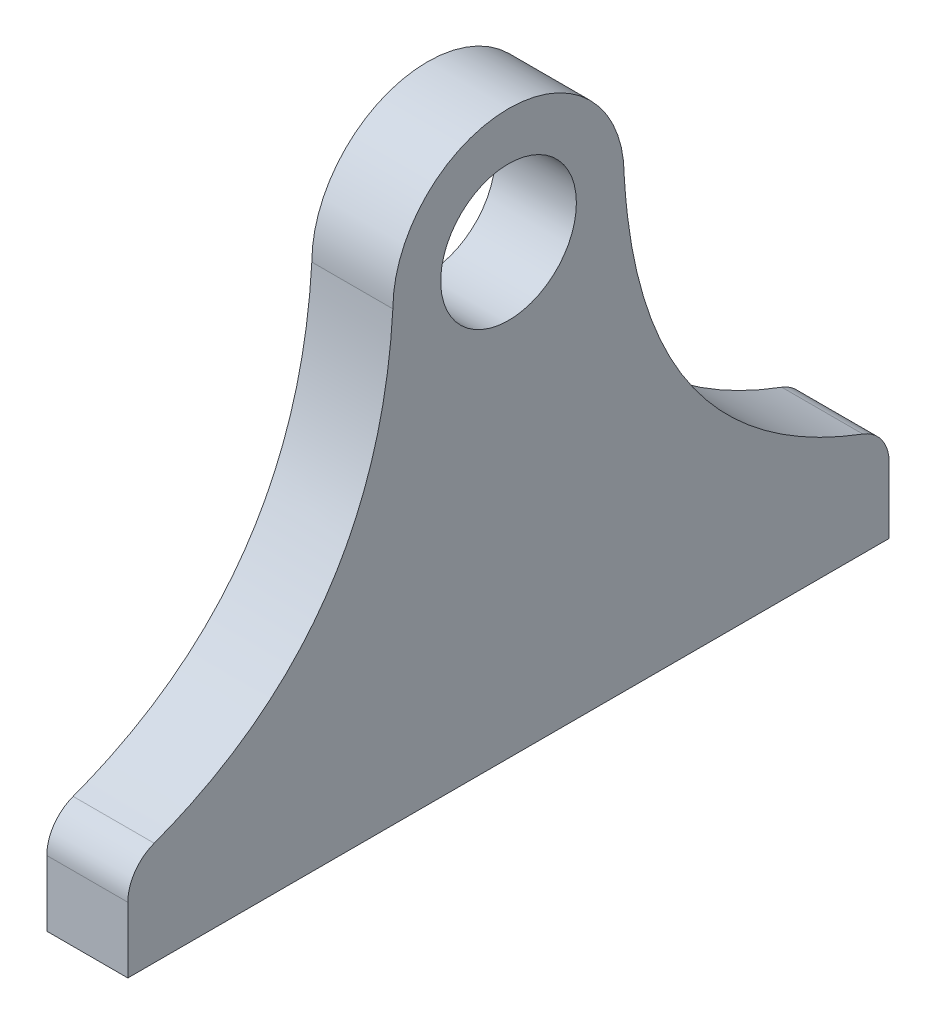
ISO-10303-21;
HEADER;
FILE_DESCRIPTION(('STEP AP214'),'2;1');
FILE_NAME('part.step','',(''),(''),'','','');
FILE_SCHEMA(('AUTOMOTIVE_DESIGN { 1 0 10303 214 1 1 1 1 }'));
ENDSEC;
DATA;
#1=APPLICATION_CONTEXT('core data for automotive mechanical design processes');
#2=APPLICATION_PROTOCOL_DEFINITION('international standard','automotive_design',2000,#1);
#3=PRODUCT_CONTEXT('',#1,'mechanical');
#4=PRODUCT('Part','Part','',(#3));
#5=PRODUCT_RELATED_PRODUCT_CATEGORY('part','',(#4));
#6=PRODUCT_DEFINITION_FORMATION('','',#4);
#7=PRODUCT_DEFINITION_CONTEXT('part definition',#1,'design');
#8=PRODUCT_DEFINITION('design','',#6,#7);
#9=PRODUCT_DEFINITION_SHAPE('','',#8);
#10=(LENGTH_UNIT() NAMED_UNIT(*) SI_UNIT(.MILLI.,.METRE.));
#11=(NAMED_UNIT(*) PLANE_ANGLE_UNIT() SI_UNIT($,.RADIAN.));
#12=(NAMED_UNIT(*) SI_UNIT($,.STERADIAN.) SOLID_ANGLE_UNIT());
#13=UNCERTAINTY_MEASURE_WITH_UNIT(LENGTH_MEASURE(1.E-05),#10,'distance_accuracy_value','');
#14=(GEOMETRIC_REPRESENTATION_CONTEXT(3) GLOBAL_UNCERTAINTY_ASSIGNED_CONTEXT((#13)) GLOBAL_UNIT_ASSIGNED_CONTEXT((#10,
#11,#12)) REPRESENTATION_CONTEXT('',''));
#15=CARTESIAN_POINT('',(0.,0.,0.));
#16=DIRECTION('',(0.,0.,1.));
#17=DIRECTION('',(1.,0.,0.));
#18=AXIS2_PLACEMENT_3D('',#15,#16,#17);
#19=CARTESIAN_POINT('',(10.,15.6514826724427,23.4182866538508));
#20=DIRECTION('',(-1.,0.,0.));
#21=DIRECTION('',(0.,0.,1.));
#22=AXIS2_PLACEMENT_3D('',#19,#20,#21);
#23=PLANE('',#22);
#24=CARTESIAN_POINT('',(10.,43.4710042432815,14.2674065208719));
#25=CARTESIAN_POINT('',(10.,9.56746322324458,16.2210968149973));
#26=CARTESIAN_POINT('',(10.,0.,46.9635464645365));
#27=B_SPLINE_CURVE_WITH_KNOTS('',2,(#24,#25,#26),.UNSPECIFIED.,.F.,.F.,(3,3),(0.,1.),.UNSPECIFIED.);
#28=CARTESIAN_POINT('',(10.,43.4710042432815,14.2674065208719));
#29=VERTEX_POINT('',#28);
#30=CARTESIAN_POINT('',(10.,1.11014117438657,43.7115149393869));
#31=VERTEX_POINT('',#30);
#32=EDGE_CURVE('E180',#29,#31,#27,.T.);
#33=ORIENTED_EDGE('',*,*,#32,.T.);
#34=CARTESIAN_POINT('',(10.,-3.57436586594641,41.9635464645365));
#35=DIRECTION('',(-1.,0.,0.));
#36=DIRECTION('',(0.,0.,1.));
#37=AXIS2_PLACEMENT_3D('',#34,#35,#36);
#38=CIRCLE('',#37,5.);
#39=CARTESIAN_POINT('',(10.,-3.57436586594641,46.9635464645365));
#40=VERTEX_POINT('',#39);
#41=EDGE_CURVE('E109',#31,#40,#38,.F.);
#42=ORIENTED_EDGE('',*,*,#41,.T.);
#43=DIRECTION('',(0.,-1.,0.));
#44=VECTOR('',#43,1.);
#45=CARTESIAN_POINT('',(10.,-11.6665772071656,46.9635464645365));
#46=LINE('',#45,#44);
#47=CARTESIAN_POINT('',(10.,-11.6665772071656,46.9635464645365));
#48=VERTEX_POINT('',#47);
#49=EDGE_CURVE('E102',#40,#48,#46,.T.);
#50=ORIENTED_EDGE('',*,*,#49,.T.);
#51=DIRECTION('',(0.,0.,-1.));
#52=VECTOR('',#51,1.);
#53=CARTESIAN_POINT('',(10.,-11.6665772071654,-46.9635464645366));
#54=LINE('',#53,#52);
#55=CARTESIAN_POINT('',(10.,-11.6665772071654,-46.9635464645366));
#56=VERTEX_POINT('',#55);
#57=EDGE_CURVE('E106',#48,#56,#54,.T.);
#58=ORIENTED_EDGE('',*,*,#57,.T.);
#59=DIRECTION('',(0.,1.,0.));
#60=VECTOR('',#59,1.);
#61=CARTESIAN_POINT('',(10.,-11.6665772071654,-46.9635464645366));
#62=LINE('',#61,#60);
#63=CARTESIAN_POINT('',(10.,-3.57436586594639,-46.9635464645366));
#64=VERTEX_POINT('',#63);
#65=EDGE_CURVE('E122',#56,#64,#62,.T.);
#66=ORIENTED_EDGE('',*,*,#65,.T.);
#67=CARTESIAN_POINT('',(10.,-3.57436586594641,-41.9635464645366));
#68=DIRECTION('',(-1.,0.,0.));
#69=DIRECTION('',(0.,0.,1.));
#70=AXIS2_PLACEMENT_3D('',#67,#68,#69);
#71=CIRCLE('',#70,5.);
#72=CARTESIAN_POINT('',(10.,1.11014117438656,-43.711514939387));
#73=VERTEX_POINT('',#72);
#74=EDGE_CURVE('E54',#64,#73,#71,.F.);
#75=ORIENTED_EDGE('',*,*,#74,.T.);
#76=CARTESIAN_POINT('',(10.,0.,-46.9635464645365));
#77=CARTESIAN_POINT('',(10.,9.56746322324458,-16.2210968149973));
#78=CARTESIAN_POINT('',(10.,43.4710042432815,-14.2674065208719));
#79=B_SPLINE_CURVE_WITH_KNOTS('',2,(#76,#77,#78),.UNSPECIFIED.,.F.,.F.,(3,3),(0.,1.),.UNSPECIFIED.);
#80=CARTESIAN_POINT('',(10.,43.4710042432815,-14.2674065208719));
#81=VERTEX_POINT('',#80);
#82=EDGE_CURVE('E150',#73,#81,#79,.T.);
#83=ORIENTED_EDGE('',*,*,#82,.T.);
#84=CARTESIAN_POINT('',(10.,43.4710042432842,1.49110636278571E-13));
#85=DIRECTION('',(1.,0.,0.));
#86=DIRECTION('',(0.,0.,-1.));
#87=AXIS2_PLACEMENT_3D('',#84,#85,#86);
#88=CIRCLE('',#87,14.2674065208717);
#89=EDGE_CURVE('E185',#81,#29,#88,.T.);
#90=ORIENTED_EDGE('',*,*,#89,.T.);
#91=EDGE_LOOP('',(#33,#42,#50,#58,#66,#75,#83,#90));
#92=FACE_BOUND('',#91,.T.);
#93=CARTESIAN_POINT('',(10.,43.4710042432842,1.49110636278571E-13));
#94=DIRECTION('',(1.,0.,0.));
#95=DIRECTION('',(0.,0.,-1.));
#96=AXIS2_PLACEMENT_3D('',#93,#94,#95);
#97=CIRCLE('',#96,8.37123201838238);
#98=CARTESIAN_POINT('',(10.,43.4710042432842,-8.37123201838224));
#99=VERTEX_POINT('',#98);
#100=EDGE_CURVE('E295',#99,#99,#97,.T.);
#101=ORIENTED_EDGE('',*,*,#100,.F.);
#102=EDGE_LOOP('',(#101));
#103=FACE_BOUND('',#102,.T.);
#104=ADVANCED_FACE('F39',(#92,#103),#23,.F.);
#105=CARTESIAN_POINT('',(0.,15.6514826724427,23.4182866538508));
#106=DIRECTION('',(-1.,0.,0.));
#107=DIRECTION('',(0.,0.,1.));
#108=AXIS2_PLACEMENT_3D('',#105,#106,#107);
#109=PLANE('',#108);
#110=DIRECTION('',(0.,-1.,0.));
#111=VECTOR('',#110,1.);
#112=CARTESIAN_POINT('',(0.,-11.6665772071656,46.9635464645365));
#113=LINE('',#112,#111);
#114=CARTESIAN_POINT('',(0.,-3.57436586594641,46.9635464645365));
#115=VERTEX_POINT('',#114);
#116=CARTESIAN_POINT('',(0.,-11.6665772071656,46.9635464645365));
#117=VERTEX_POINT('',#116);
#118=EDGE_CURVE('E126',#115,#117,#113,.T.);
#119=ORIENTED_EDGE('',*,*,#118,.F.);
#120=CARTESIAN_POINT('',(0.,-3.57436586594641,41.9635464645365));
#121=DIRECTION('',(-1.,0.,0.));
#122=DIRECTION('',(0.,0.,1.));
#123=AXIS2_PLACEMENT_3D('',#120,#121,#122);
#124=CIRCLE('',#123,5.);
#125=CARTESIAN_POINT('',(0.,1.11014117438657,43.7115149393869));
#126=VERTEX_POINT('',#125);
#127=EDGE_CURVE('E137',#115,#126,#124,.T.);
#128=ORIENTED_EDGE('',*,*,#127,.T.);
#129=CARTESIAN_POINT('',(0.,43.4710042432815,14.2674065208719));
#130=CARTESIAN_POINT('',(0.,9.56746322324458,16.2210968149973));
#131=CARTESIAN_POINT('',(0.,0.,46.9635464645365));
#132=B_SPLINE_CURVE_WITH_KNOTS('',2,(#129,#130,#131),.UNSPECIFIED.,.F.,.F.,(3,3),(0.,1.),.UNSPECIFIED.);
#133=CARTESIAN_POINT('',(0.,43.4710042432815,14.2674065208719));
#134=VERTEX_POINT('',#133);
#135=EDGE_CURVE('E114',#134,#126,#132,.T.);
#136=ORIENTED_EDGE('',*,*,#135,.F.);
#137=CARTESIAN_POINT('',(0.,43.4710042432842,1.49110636278571E-13));
#138=DIRECTION('',(1.,0.,0.));
#139=DIRECTION('',(0.,0.,-1.));
#140=AXIS2_PLACEMENT_3D('',#137,#138,#139);
#141=CIRCLE('',#140,14.2674065208717);
#142=CARTESIAN_POINT('',(0.,43.4710042432815,-14.2674065208719));
#143=VERTEX_POINT('',#142);
#144=EDGE_CURVE('E158',#143,#134,#141,.T.);
#145=ORIENTED_EDGE('',*,*,#144,.F.);
#146=CARTESIAN_POINT('',(0.,0.,-46.9635464645365));
#147=CARTESIAN_POINT('',(0.,9.56746322324458,-16.2210968149973));
#148=CARTESIAN_POINT('',(0.,43.4710042432815,-14.2674065208719));
#149=B_SPLINE_CURVE_WITH_KNOTS('',2,(#146,#147,#148),.UNSPECIFIED.,.F.,.F.,(3,3),(0.,1.),.UNSPECIFIED.);
#150=CARTESIAN_POINT('',(0.,1.11014117438656,-43.711514939387));
#151=VERTEX_POINT('',#150);
#152=EDGE_CURVE('E148',#151,#143,#149,.T.);
#153=ORIENTED_EDGE('',*,*,#152,.F.);
#154=CARTESIAN_POINT('',(0.,-3.57436586594641,-41.9635464645366));
#155=DIRECTION('',(-1.,0.,0.));
#156=DIRECTION('',(0.,0.,1.));
#157=AXIS2_PLACEMENT_3D('',#154,#155,#156);
#158=CIRCLE('',#157,5.);
#159=CARTESIAN_POINT('',(0.,-3.57436586594639,-46.9635464645366));
#160=VERTEX_POINT('',#159);
#161=EDGE_CURVE('E130',#151,#160,#158,.T.);
#162=ORIENTED_EDGE('',*,*,#161,.T.);
#163=DIRECTION('',(0.,1.,0.));
#164=VECTOR('',#163,1.);
#165=CARTESIAN_POINT('',(0.,-11.6665772071654,-46.9635464645366));
#166=LINE('',#165,#164);
#167=CARTESIAN_POINT('',(0.,-11.6665772071654,-46.9635464645366));
#168=VERTEX_POINT('',#167);
#169=EDGE_CURVE('E159',#168,#160,#166,.T.);
#170=ORIENTED_EDGE('',*,*,#169,.F.);
#171=DIRECTION('',(0.,0.,-1.));
#172=VECTOR('',#171,1.);
#173=CARTESIAN_POINT('',(0.,-11.6665772071654,-46.9635464645366));
#174=LINE('',#173,#172);
#175=EDGE_CURVE('E162',#117,#168,#174,.T.);
#176=ORIENTED_EDGE('',*,*,#175,.F.);
#177=EDGE_LOOP('',(#119,#128,#136,#145,#153,#162,#170,#176));
#178=FACE_BOUND('',#177,.T.);
#179=CARTESIAN_POINT('',(0.,43.4710042432842,1.49110636278571E-13));
#180=DIRECTION('',(1.,0.,0.));
#181=DIRECTION('',(0.,0.,-1.));
#182=AXIS2_PLACEMENT_3D('',#179,#180,#181);
#183=CIRCLE('',#182,8.37123201838238);
#184=CARTESIAN_POINT('',(0.,43.4710042432842,-8.37123201838224));
#185=VERTEX_POINT('',#184);
#186=EDGE_CURVE('E297',#185,#185,#183,.T.);
#187=ORIENTED_EDGE('',*,*,#186,.T.);
#188=EDGE_LOOP('',(#187));
#189=FACE_BOUND('',#188,.T.);
#190=ADVANCED_FACE('F154',(#178,#189),#109,.T.);
#191=CARTESIAN_POINT('',(10.,-11.6665772071656,46.9635464645365));
#192=DIRECTION('',(0.,0.,-1.));
#193=DIRECTION('',(-1.,0.,0.));
#194=AXIS2_PLACEMENT_3D('',#191,#192,#193);
#195=PLANE('',#194);
#196=ORIENTED_EDGE('',*,*,#49,.F.);
#197=DIRECTION('',(-1.,0.,0.));
#198=VECTOR('',#197,1.);
#199=CARTESIAN_POINT('',(10.,-3.57436586594641,46.9635464645365));
#200=LINE('',#199,#198);
#201=EDGE_CURVE('E128',#40,#115,#200,.T.);
#202=ORIENTED_EDGE('',*,*,#201,.T.);
#203=ORIENTED_EDGE('',*,*,#118,.T.);
#204=DIRECTION('',(-1.,0.,0.));
#205=VECTOR('',#204,1.);
#206=CARTESIAN_POINT('',(10.,-11.6665772071656,46.9635464645365));
#207=LINE('',#206,#205);
#208=EDGE_CURVE('E119',#48,#117,#207,.T.);
#209=ORIENTED_EDGE('',*,*,#208,.F.);
#210=EDGE_LOOP('',(#196,#202,#203,#209));
#211=FACE_BOUND('',#210,.T.);
#212=ADVANCED_FACE('F124',(#211),#195,.F.);
#213=CARTESIAN_POINT('',(10.,-11.6665772071654,-46.9635464645366));
#214=DIRECTION('',(0.,1.,0.));
#215=DIRECTION('',(0.,0.,1.));
#216=AXIS2_PLACEMENT_3D('',#213,#214,#215);
#217=PLANE('',#216);
#218=ORIENTED_EDGE('',*,*,#175,.T.);
#219=DIRECTION('',(-1.,0.,0.));
#220=VECTOR('',#219,1.);
#221=CARTESIAN_POINT('',(10.,-11.6665772071654,-46.9635464645366));
#222=LINE('',#221,#220);
#223=EDGE_CURVE('E121',#56,#168,#222,.T.);
#224=ORIENTED_EDGE('',*,*,#223,.F.);
#225=ORIENTED_EDGE('',*,*,#57,.F.);
#226=ORIENTED_EDGE('',*,*,#208,.T.);
#227=EDGE_LOOP('',(#218,#224,#225,#226));
#228=FACE_BOUND('',#227,.T.);
#229=ADVANCED_FACE('F118',(#228),#217,.F.);
#230=CARTESIAN_POINT('',(10.,-11.6665772071654,-46.9635464645366));
#231=DIRECTION('',(0.,0.,1.));
#232=DIRECTION('',(0.,-1.,0.));
#233=AXIS2_PLACEMENT_3D('',#230,#231,#232);
#234=PLANE('',#233);
#235=ORIENTED_EDGE('',*,*,#169,.T.);
#236=DIRECTION('',(-1.,0.,0.));
#237=VECTOR('',#236,1.);
#238=CARTESIAN_POINT('',(10.,-3.57436586594639,-46.9635464645366));
#239=LINE('',#238,#237);
#240=EDGE_CURVE('E11',#160,#64,#239,.F.);
#241=ORIENTED_EDGE('',*,*,#240,.T.);
#242=ORIENTED_EDGE('',*,*,#65,.F.);
#243=ORIENTED_EDGE('',*,*,#223,.T.);
#244=EDGE_LOOP('',(#235,#241,#242,#243));
#245=FACE_BOUND('',#244,.T.);
#246=ADVANCED_FACE('F213',(#245),#234,.F.);
#247=DIRECTION('',(-1.,0.,0.));
#248=VECTOR('',#247,1.);
#249=SURFACE_OF_LINEAR_EXTRUSION('',#79,#248);
#250=ORIENTED_EDGE('',*,*,#82,.F.);
#251=DIRECTION('',(-1.,0.,0.));
#252=VECTOR('',#251,1.);
#253=CARTESIAN_POINT('',(10.,1.11014117438656,-43.711514939387));
#254=LINE('',#253,#252);
#255=EDGE_CURVE('E47',#73,#151,#254,.T.);
#256=ORIENTED_EDGE('',*,*,#255,.T.);
#257=ORIENTED_EDGE('',*,*,#152,.T.);
#258=DIRECTION('',(-1.,0.,0.));
#259=VECTOR('',#258,1.);
#260=CARTESIAN_POINT('',(10.,43.4710042432815,-14.2674065208719));
#261=LINE('',#260,#259);
#262=EDGE_CURVE('E132',#81,#143,#261,.T.);
#263=ORIENTED_EDGE('',*,*,#262,.F.);
#264=EDGE_LOOP('',(#250,#256,#257,#263));
#265=FACE_BOUND('',#264,.T.);
#266=ADVANCED_FACE('F146',(#265),#249,.F.);
#267=CARTESIAN_POINT('',(10.,43.4710042432842,1.49110636278571E-13));
#268=DIRECTION('',(-1.,0.,0.));
#269=DIRECTION('',(0.,0.,1.));
#270=AXIS2_PLACEMENT_3D('',#267,#268,#269);
#271=CYLINDRICAL_SURFACE('',#270,14.2674065208717);
#272=ORIENTED_EDGE('',*,*,#144,.T.);
#273=DIRECTION('',(-1.,0.,0.));
#274=VECTOR('',#273,1.);
#275=CARTESIAN_POINT('',(10.,43.4710042432815,14.2674065208719));
#276=LINE('',#275,#274);
#277=EDGE_CURVE('E175',#29,#134,#276,.T.);
#278=ORIENTED_EDGE('',*,*,#277,.F.);
#279=ORIENTED_EDGE('',*,*,#89,.F.);
#280=ORIENTED_EDGE('',*,*,#262,.T.);
#281=EDGE_LOOP('',(#272,#278,#279,#280));
#282=FACE_BOUND('',#281,.T.);
#283=ADVANCED_FACE('F183',(#282),#271,.T.);
#284=DIRECTION('',(-1.,0.,0.));
#285=VECTOR('',#284,1.);
#286=SURFACE_OF_LINEAR_EXTRUSION('',#27,#285);
#287=ORIENTED_EDGE('',*,*,#135,.T.);
#288=DIRECTION('',(-1.,0.,0.));
#289=VECTOR('',#288,1.);
#290=CARTESIAN_POINT('',(0.,1.11014117438656,43.7115149393869));
#291=LINE('',#290,#289);
#292=EDGE_CURVE('E139',#126,#31,#291,.F.);
#293=ORIENTED_EDGE('',*,*,#292,.T.);
#294=ORIENTED_EDGE('',*,*,#32,.F.);
#295=ORIENTED_EDGE('',*,*,#277,.T.);
#296=EDGE_LOOP('',(#287,#293,#294,#295));
#297=FACE_BOUND('',#296,.T.);
#298=ADVANCED_FACE('F202',(#297),#286,.F.);
#299=CARTESIAN_POINT('',(10.,43.4710042432842,1.49110636278571E-13));
#300=DIRECTION('',(-1.,0.,0.));
#301=DIRECTION('',(0.,0.,1.));
#302=AXIS2_PLACEMENT_3D('',#299,#300,#301);
#303=CYLINDRICAL_SURFACE('',#302,8.37123201838238);
#304=ORIENTED_EDGE('',*,*,#100,.T.);
#305=EDGE_LOOP('',(#304));
#306=FACE_BOUND('',#305,.T.);
#307=ORIENTED_EDGE('',*,*,#186,.F.);
#308=EDGE_LOOP('',(#307));
#309=FACE_BOUND('',#308,.T.);
#310=ADVANCED_FACE('F206',(#306,#309),#303,.F.);
#311=CARTESIAN_POINT('',(5.,-3.57436586594641,41.9635464645365));
#312=DIRECTION('',(-1.,0.,0.));
#313=DIRECTION('',(0.,0.,1.));
#314=AXIS2_PLACEMENT_3D('',#311,#312,#313);
#315=CYLINDRICAL_SURFACE('',#314,5.);
#316=ORIENTED_EDGE('',*,*,#41,.F.);
#317=ORIENTED_EDGE('',*,*,#292,.F.);
#318=ORIENTED_EDGE('',*,*,#127,.F.);
#319=ORIENTED_EDGE('',*,*,#201,.F.);
#320=EDGE_LOOP('',(#316,#317,#318,#319));
#321=FACE_BOUND('',#320,.T.);
#322=ADVANCED_FACE('F219',(#321),#315,.T.);
#323=CARTESIAN_POINT('',(5.,-3.57436586594641,-41.9635464645366));
#324=DIRECTION('',(-1.,0.,0.));
#325=DIRECTION('',(0.,0.,1.));
#326=AXIS2_PLACEMENT_3D('',#323,#324,#325);
#327=CYLINDRICAL_SURFACE('',#326,5.);
#328=ORIENTED_EDGE('',*,*,#74,.F.);
#329=ORIENTED_EDGE('',*,*,#240,.F.);
#330=ORIENTED_EDGE('',*,*,#161,.F.);
#331=ORIENTED_EDGE('',*,*,#255,.F.);
#332=EDGE_LOOP('',(#328,#329,#330,#331));
#333=FACE_BOUND('',#332,.T.);
#334=ADVANCED_FACE('F41',(#333),#327,.T.);
#335=CLOSED_SHELL('',(#104,#190,#212,#229,#246,#266,#283,#298,#310,#322,#334));
#336=MANIFOLD_SOLID_BREP('B2',#335);
#337=ADVANCED_BREP_SHAPE_REPRESENTATION('',(#18,#336),#14);
#338=SHAPE_DEFINITION_REPRESENTATION(#9,#337);
ENDSEC;
END-ISO-10303-21;
